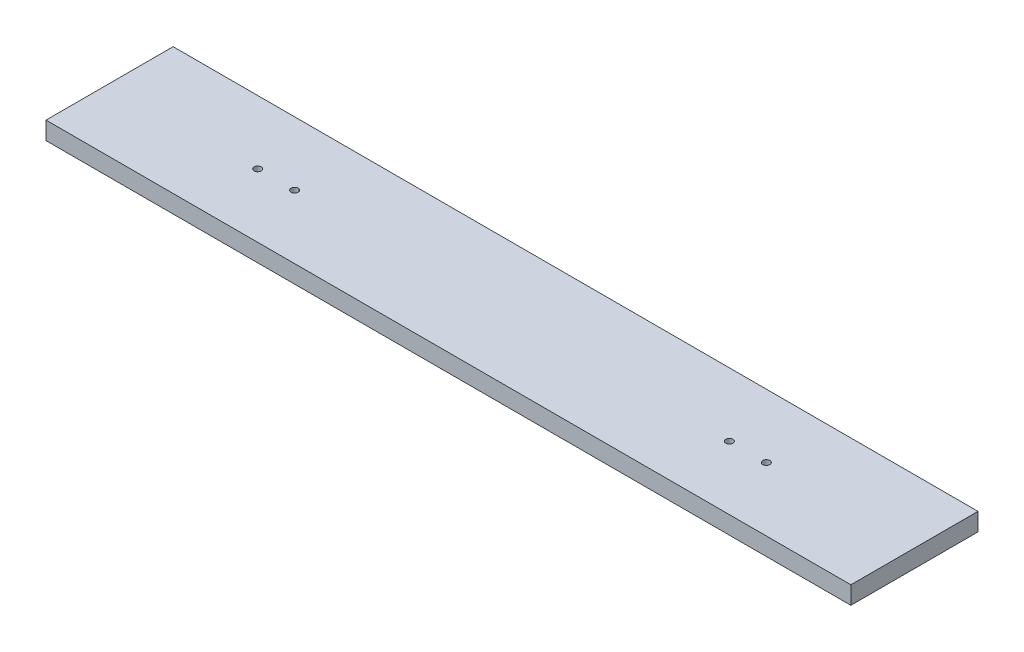
ISO-10303-21;
HEADER;
FILE_DESCRIPTION(('STEP AP214'),'2;1');
FILE_NAME('part.step','',(''),(''),'','','');
FILE_SCHEMA(('AUTOMOTIVE_DESIGN { 1 0 10303 214 1 1 1 1 }'));
ENDSEC;
DATA;
#1=APPLICATION_CONTEXT('core data for automotive mechanical design processes');
#2=APPLICATION_PROTOCOL_DEFINITION('international standard','automotive_design',2000,#1);
#3=PRODUCT_CONTEXT('',#1,'mechanical');
#4=PRODUCT('Part','Part','',(#3));
#5=PRODUCT_RELATED_PRODUCT_CATEGORY('part','',(#4));
#6=PRODUCT_DEFINITION_FORMATION('','',#4);
#7=PRODUCT_DEFINITION_CONTEXT('part definition',#1,'design');
#8=PRODUCT_DEFINITION('design','',#6,#7);
#9=PRODUCT_DEFINITION_SHAPE('','',#8);
#10=(LENGTH_UNIT() NAMED_UNIT(*) SI_UNIT(.MILLI.,.METRE.));
#11=(NAMED_UNIT(*) PLANE_ANGLE_UNIT() SI_UNIT($,.RADIAN.));
#12=(NAMED_UNIT(*) SI_UNIT($,.STERADIAN.) SOLID_ANGLE_UNIT());
#13=UNCERTAINTY_MEASURE_WITH_UNIT(LENGTH_MEASURE(1.E-05),#10,'distance_accuracy_value','');
#14=(GEOMETRIC_REPRESENTATION_CONTEXT(3) GLOBAL_UNCERTAINTY_ASSIGNED_CONTEXT((#13)) GLOBAL_UNIT_ASSIGNED_CONTEXT((#10,
#11,#12)) REPRESENTATION_CONTEXT('',''));
#15=CARTESIAN_POINT('',(0.,0.,0.));
#16=DIRECTION('',(0.,0.,1.));
#17=DIRECTION('',(1.,0.,0.));
#18=AXIS2_PLACEMENT_3D('',#15,#16,#17);
#19=CARTESIAN_POINT('',(-401.955,-8.89,127.));
#20=DIRECTION('',(0.,1.,0.));
#21=DIRECTION('',(0.,0.,1.));
#22=AXIS2_PLACEMENT_3D('',#19,#20,#21);
#23=PLANE('',#22);
#24=CARTESIAN_POINT('',(-217.17,-8.89,63.5));
#25=DIRECTION('',(0.,-1.,0.));
#26=DIRECTION('',(0.,0.,-1.));
#27=AXIS2_PLACEMENT_3D('',#24,#25,#26);
#28=CIRCLE('',#27,3.55600000000001);
#29=CARTESIAN_POINT('',(-217.17,-8.89,59.944));
#30=VERTEX_POINT('',#29);
#31=EDGE_CURVE('E139',#30,#30,#28,.T.);
#32=ORIENTED_EDGE('',*,*,#31,.F.);
#33=EDGE_LOOP('',(#32));
#34=FACE_BOUND('',#33,.T.);
#35=CARTESIAN_POINT('',(217.17,-8.89,63.5));
#36=DIRECTION('',(0.,-1.,0.));
#37=DIRECTION('',(0.,0.,-1.));
#38=AXIS2_PLACEMENT_3D('',#35,#36,#37);
#39=CIRCLE('',#38,3.55600000000001);
#40=CARTESIAN_POINT('',(217.17,-8.89,59.944));
#41=VERTEX_POINT('',#40);
#42=EDGE_CURVE('E143',#41,#41,#39,.T.);
#43=ORIENTED_EDGE('',*,*,#42,.F.);
#44=EDGE_LOOP('',(#43));
#45=FACE_BOUND('',#44,.T.);
#46=CARTESIAN_POINT('',(-254.,-8.89,63.5));
#47=DIRECTION('',(0.,1.,0.));
#48=DIRECTION('',(0.,0.,1.));
#49=AXIS2_PLACEMENT_3D('',#46,#47,#48);
#50=CIRCLE('',#49,3.55600000000001);
#51=CARTESIAN_POINT('',(-254.,-8.89,67.056));
#52=VERTEX_POINT('',#51);
#53=EDGE_CURVE('E106',#52,#52,#50,.T.);
#54=ORIENTED_EDGE('',*,*,#53,.T.);
#55=EDGE_LOOP('',(#54));
#56=FACE_BOUND('',#55,.T.);
#57=CARTESIAN_POINT('',(254.,-8.89,63.5000000000001));
#58=DIRECTION('',(0.,1.,0.));
#59=DIRECTION('',(0.,0.,1.));
#60=AXIS2_PLACEMENT_3D('',#57,#58,#59);
#61=CIRCLE('',#60,3.55600000000001);
#62=CARTESIAN_POINT('',(254.,-8.89,67.0560000000001));
#63=VERTEX_POINT('',#62);
#64=EDGE_CURVE('E149',#63,#63,#61,.T.);
#65=ORIENTED_EDGE('',*,*,#64,.T.);
#66=EDGE_LOOP('',(#65));
#67=FACE_BOUND('',#66,.T.);
#68=DIRECTION('',(1.,0.,0.));
#69=VECTOR('',#68,1.);
#70=CARTESIAN_POINT('',(-401.955,-8.89,0.));
#71=LINE('',#70,#69);
#72=CARTESIAN_POINT('',(-401.955,-8.89,0.));
#73=VERTEX_POINT('',#72);
#74=CARTESIAN_POINT('',(401.955,-8.89,0.));
#75=VERTEX_POINT('',#74);
#76=EDGE_CURVE('E103',#73,#75,#71,.T.);
#77=ORIENTED_EDGE('',*,*,#76,.T.);
#78=DIRECTION('',(0.,0.,-1.));
#79=VECTOR('',#78,1.);
#80=CARTESIAN_POINT('',(401.955,-8.89,127.));
#81=LINE('',#80,#79);
#82=CARTESIAN_POINT('',(401.955,-8.89,127.));
#83=VERTEX_POINT('',#82);
#84=EDGE_CURVE('E11',#83,#75,#81,.T.);
#85=ORIENTED_EDGE('',*,*,#84,.F.);
#86=DIRECTION('',(1.,0.,0.));
#87=VECTOR('',#86,1.);
#88=CARTESIAN_POINT('',(-401.955,-8.89,127.));
#89=LINE('',#88,#87);
#90=CARTESIAN_POINT('',(-401.955,-8.89,127.));
#91=VERTEX_POINT('',#90);
#92=EDGE_CURVE('E80',#91,#83,#89,.T.);
#93=ORIENTED_EDGE('',*,*,#92,.F.);
#94=DIRECTION('',(0.,0.,-1.));
#95=VECTOR('',#94,1.);
#96=CARTESIAN_POINT('',(-401.955,-8.89,127.));
#97=LINE('',#96,#95);
#98=EDGE_CURVE('E99',#91,#73,#97,.T.);
#99=ORIENTED_EDGE('',*,*,#98,.T.);
#100=EDGE_LOOP('',(#77,#85,#93,#99));
#101=FACE_BOUND('',#100,.T.);
#102=ADVANCED_FACE('F41',(#34,#45,#56,#67,#101),#23,.F.);
#103=CARTESIAN_POINT('',(401.955,8.89,127.));
#104=DIRECTION('',(1.,0.,0.));
#105=DIRECTION('',(0.,0.,-1.));
#106=AXIS2_PLACEMENT_3D('',#103,#104,#105);
#107=PLANE('',#106);
#108=DIRECTION('',(0.,-1.,0.));
#109=VECTOR('',#108,1.);
#110=CARTESIAN_POINT('',(401.955,8.89,0.));
#111=LINE('',#110,#109);
#112=CARTESIAN_POINT('',(401.955,8.89,0.));
#113=VERTEX_POINT('',#112);
#114=EDGE_CURVE('E89',#113,#75,#111,.T.);
#115=ORIENTED_EDGE('',*,*,#114,.F.);
#116=DIRECTION('',(0.,0.,-1.));
#117=VECTOR('',#116,1.);
#118=CARTESIAN_POINT('',(401.955,8.89,127.));
#119=LINE('',#118,#117);
#120=CARTESIAN_POINT('',(401.955,8.89,127.));
#121=VERTEX_POINT('',#120);
#122=EDGE_CURVE('E49',#121,#113,#119,.T.);
#123=ORIENTED_EDGE('',*,*,#122,.F.);
#124=DIRECTION('',(0.,-1.,0.));
#125=VECTOR('',#124,1.);
#126=CARTESIAN_POINT('',(401.955,8.89,127.));
#127=LINE('',#126,#125);
#128=EDGE_CURVE('E87',#121,#83,#127,.T.);
#129=ORIENTED_EDGE('',*,*,#128,.T.);
#130=ORIENTED_EDGE('',*,*,#84,.T.);
#131=EDGE_LOOP('',(#115,#123,#129,#130));
#132=FACE_BOUND('',#131,.T.);
#133=ADVANCED_FACE('F86',(#132),#107,.T.);
#134=CARTESIAN_POINT('',(-401.955,8.89,127.));
#135=DIRECTION('',(0.,1.,0.));
#136=DIRECTION('',(0.,0.,1.));
#137=AXIS2_PLACEMENT_3D('',#134,#135,#136);
#138=PLANE('',#137);
#139=CARTESIAN_POINT('',(-217.17,8.89,63.5));
#140=DIRECTION('',(0.,-1.,0.));
#141=DIRECTION('',(0.,0.,-1.));
#142=AXIS2_PLACEMENT_3D('',#139,#140,#141);
#143=CIRCLE('',#142,3.55600000000001);
#144=CARTESIAN_POINT('',(-217.17,8.89,59.944));
#145=VERTEX_POINT('',#144);
#146=EDGE_CURVE('E151',#145,#145,#143,.T.);
#147=ORIENTED_EDGE('',*,*,#146,.T.);
#148=EDGE_LOOP('',(#147));
#149=FACE_BOUND('',#148,.T.);
#150=CARTESIAN_POINT('',(217.17,8.89,63.5));
#151=DIRECTION('',(0.,-1.,0.));
#152=DIRECTION('',(0.,0.,-1.));
#153=AXIS2_PLACEMENT_3D('',#150,#151,#152);
#154=CIRCLE('',#153,3.55600000000001);
#155=CARTESIAN_POINT('',(217.17,8.89,59.944));
#156=VERTEX_POINT('',#155);
#157=EDGE_CURVE('E162',#156,#156,#154,.T.);
#158=ORIENTED_EDGE('',*,*,#157,.T.);
#159=EDGE_LOOP('',(#158));
#160=FACE_BOUND('',#159,.T.);
#161=CARTESIAN_POINT('',(-254.,8.89,63.5));
#162=DIRECTION('',(0.,1.,0.));
#163=DIRECTION('',(0.,0.,1.));
#164=AXIS2_PLACEMENT_3D('',#161,#162,#163);
#165=CIRCLE('',#164,3.55600000000001);
#166=CARTESIAN_POINT('',(-254.,8.89,67.056));
#167=VERTEX_POINT('',#166);
#168=EDGE_CURVE('E154',#167,#167,#165,.T.);
#169=ORIENTED_EDGE('',*,*,#168,.F.);
#170=EDGE_LOOP('',(#169));
#171=FACE_BOUND('',#170,.T.);
#172=CARTESIAN_POINT('',(254.,8.89,63.5000000000001));
#173=DIRECTION('',(0.,1.,0.));
#174=DIRECTION('',(0.,0.,1.));
#175=AXIS2_PLACEMENT_3D('',#172,#173,#174);
#176=CIRCLE('',#175,3.55600000000001);
#177=CARTESIAN_POINT('',(254.,8.89,67.0560000000001));
#178=VERTEX_POINT('',#177);
#179=EDGE_CURVE('E150',#178,#178,#176,.T.);
#180=ORIENTED_EDGE('',*,*,#179,.F.);
#181=EDGE_LOOP('',(#180));
#182=FACE_BOUND('',#181,.T.);
#183=DIRECTION('',(1.,0.,0.));
#184=VECTOR('',#183,1.);
#185=CARTESIAN_POINT('',(-401.955,8.89,0.));
#186=LINE('',#185,#184);
#187=CARTESIAN_POINT('',(-401.955,8.89,0.));
#188=VERTEX_POINT('',#187);
#189=EDGE_CURVE('E108',#188,#113,#186,.T.);
#190=ORIENTED_EDGE('',*,*,#189,.F.);
#191=DIRECTION('',(0.,0.,-1.));
#192=VECTOR('',#191,1.);
#193=CARTESIAN_POINT('',(-401.955,8.89,127.));
#194=LINE('',#193,#192);
#195=CARTESIAN_POINT('',(-401.955,8.89,127.));
#196=VERTEX_POINT('',#195);
#197=EDGE_CURVE('E72',#196,#188,#194,.T.);
#198=ORIENTED_EDGE('',*,*,#197,.F.);
#199=DIRECTION('',(1.,0.,0.));
#200=VECTOR('',#199,1.);
#201=CARTESIAN_POINT('',(-401.955,8.89,127.));
#202=LINE('',#201,#200);
#203=EDGE_CURVE('E95',#196,#121,#202,.T.);
#204=ORIENTED_EDGE('',*,*,#203,.T.);
#205=ORIENTED_EDGE('',*,*,#122,.T.);
#206=EDGE_LOOP('',(#190,#198,#204,#205));
#207=FACE_BOUND('',#206,.T.);
#208=ADVANCED_FACE('F97',(#149,#160,#171,#182,#207),#138,.T.);
#209=CARTESIAN_POINT('',(-401.955,8.89,127.));
#210=DIRECTION('',(1.,0.,0.));
#211=DIRECTION('',(0.,0.,-1.));
#212=AXIS2_PLACEMENT_3D('',#209,#210,#211);
#213=PLANE('',#212);
#214=DIRECTION('',(0.,-1.,0.));
#215=VECTOR('',#214,1.);
#216=CARTESIAN_POINT('',(-401.955,8.89,0.));
#217=LINE('',#216,#215);
#218=EDGE_CURVE('E75',#188,#73,#217,.T.);
#219=ORIENTED_EDGE('',*,*,#218,.T.);
#220=ORIENTED_EDGE('',*,*,#98,.F.);
#221=DIRECTION('',(0.,-1.,0.));
#222=VECTOR('',#221,1.);
#223=CARTESIAN_POINT('',(-401.955,8.89,127.));
#224=LINE('',#223,#222);
#225=EDGE_CURVE('E57',#196,#91,#224,.T.);
#226=ORIENTED_EDGE('',*,*,#225,.F.);
#227=ORIENTED_EDGE('',*,*,#197,.T.);
#228=EDGE_LOOP('',(#219,#220,#226,#227));
#229=FACE_BOUND('',#228,.T.);
#230=ADVANCED_FACE('F126',(#229),#213,.F.);
#231=CARTESIAN_POINT('',(0.,0.,127.));
#232=DIRECTION('',(0.,0.,-1.));
#233=DIRECTION('',(-1.,0.,0.));
#234=AXIS2_PLACEMENT_3D('',#231,#232,#233);
#235=PLANE('',#234);
#236=ORIENTED_EDGE('',*,*,#92,.T.);
#237=ORIENTED_EDGE('',*,*,#128,.F.);
#238=ORIENTED_EDGE('',*,*,#203,.F.);
#239=ORIENTED_EDGE('',*,*,#225,.T.);
#240=EDGE_LOOP('',(#236,#237,#238,#239));
#241=FACE_BOUND('',#240,.T.);
#242=ADVANCED_FACE('F94',(#241),#235,.F.);
#243=CARTESIAN_POINT('',(0.,0.,0.));
#244=DIRECTION('',(0.,0.,-1.));
#245=DIRECTION('',(-1.,0.,0.));
#246=AXIS2_PLACEMENT_3D('',#243,#244,#245);
#247=PLANE('',#246);
#248=ORIENTED_EDGE('',*,*,#76,.F.);
#249=ORIENTED_EDGE('',*,*,#218,.F.);
#250=ORIENTED_EDGE('',*,*,#189,.T.);
#251=ORIENTED_EDGE('',*,*,#114,.T.);
#252=EDGE_LOOP('',(#248,#249,#250,#251));
#253=FACE_BOUND('',#252,.T.);
#254=ADVANCED_FACE('F115',(#253),#247,.T.);
#255=CARTESIAN_POINT('',(254.,-8.89,63.5000000000001));
#256=DIRECTION('',(0.,1.,0.));
#257=DIRECTION('',(0.,0.,1.));
#258=AXIS2_PLACEMENT_3D('',#255,#256,#257);
#259=CYLINDRICAL_SURFACE('',#258,3.55600000000001);
#260=ORIENTED_EDGE('',*,*,#64,.F.);
#261=EDGE_LOOP('',(#260));
#262=FACE_BOUND('',#261,.T.);
#263=ORIENTED_EDGE('',*,*,#179,.T.);
#264=EDGE_LOOP('',(#263));
#265=FACE_BOUND('',#264,.T.);
#266=ADVANCED_FACE('F117',(#262,#265),#259,.F.);
#267=CARTESIAN_POINT('',(-254.,-8.89,63.5));
#268=DIRECTION('',(0.,1.,0.));
#269=DIRECTION('',(0.,0.,1.));
#270=AXIS2_PLACEMENT_3D('',#267,#268,#269);
#271=CYLINDRICAL_SURFACE('',#270,3.55600000000001);
#272=ORIENTED_EDGE('',*,*,#53,.F.);
#273=EDGE_LOOP('',(#272));
#274=FACE_BOUND('',#273,.T.);
#275=ORIENTED_EDGE('',*,*,#168,.T.);
#276=EDGE_LOOP('',(#275));
#277=FACE_BOUND('',#276,.T.);
#278=ADVANCED_FACE('F123',(#274,#277),#271,.F.);
#279=CARTESIAN_POINT('',(217.17,8.89,63.5));
#280=DIRECTION('',(0.,-1.,0.));
#281=DIRECTION('',(0.,0.,-1.));
#282=AXIS2_PLACEMENT_3D('',#279,#280,#281);
#283=CYLINDRICAL_SURFACE('',#282,3.55600000000001);
#284=ORIENTED_EDGE('',*,*,#157,.F.);
#285=EDGE_LOOP('',(#284));
#286=FACE_BOUND('',#285,.T.);
#287=ORIENTED_EDGE('',*,*,#42,.T.);
#288=EDGE_LOOP('',(#287));
#289=FACE_BOUND('',#288,.T.);
#290=ADVANCED_FACE('F169',(#286,#289),#283,.F.);
#291=CARTESIAN_POINT('',(-217.17,8.89,63.5));
#292=DIRECTION('',(0.,-1.,0.));
#293=DIRECTION('',(0.,0.,-1.));
#294=AXIS2_PLACEMENT_3D('',#291,#292,#293);
#295=CYLINDRICAL_SURFACE('',#294,3.55600000000001);
#296=ORIENTED_EDGE('',*,*,#146,.F.);
#297=EDGE_LOOP('',(#296));
#298=FACE_BOUND('',#297,.T.);
#299=ORIENTED_EDGE('',*,*,#31,.T.);
#300=EDGE_LOOP('',(#299));
#301=FACE_BOUND('',#300,.T.);
#302=ADVANCED_FACE('F167',(#298,#301),#295,.F.);
#303=CLOSED_SHELL('',(#102,#133,#208,#230,#242,#254,#266,#278,#290,#302));
#304=MANIFOLD_SOLID_BREP('B2',#303);
#305=ADVANCED_BREP_SHAPE_REPRESENTATION('',(#18,#304),#14);
#306=SHAPE_DEFINITION_REPRESENTATION(#9,#305);
ENDSEC;
END-ISO-10303-21;
